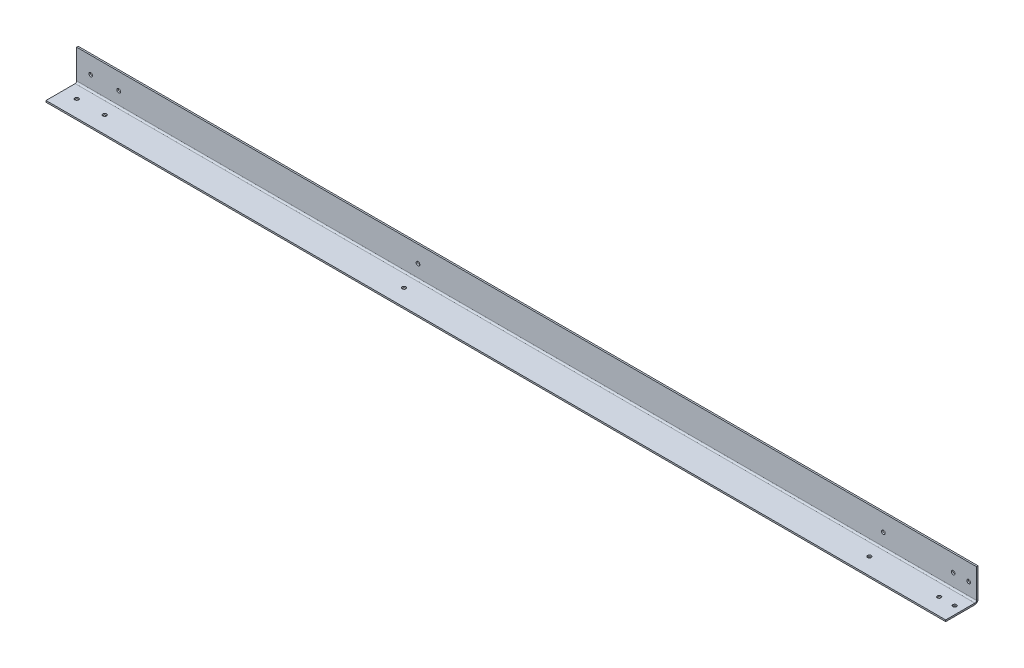
ISO-10303-21;
HEADER;
FILE_DESCRIPTION(('STEP AP214'),'2;1');
FILE_NAME('part.step','',(''),(''),'','','');
FILE_SCHEMA(('AUTOMOTIVE_DESIGN { 1 0 10303 214 1 1 1 1 }'));
ENDSEC;
DATA;
#1=APPLICATION_CONTEXT('core data for automotive mechanical design processes');
#2=APPLICATION_PROTOCOL_DEFINITION('international standard','automotive_design',2000,#1);
#3=PRODUCT_CONTEXT('',#1,'mechanical');
#4=PRODUCT('Part','Part','',(#3));
#5=PRODUCT_RELATED_PRODUCT_CATEGORY('part','',(#4));
#6=PRODUCT_DEFINITION_FORMATION('','',#4);
#7=PRODUCT_DEFINITION_CONTEXT('part definition',#1,'design');
#8=PRODUCT_DEFINITION('design','',#6,#7);
#9=PRODUCT_DEFINITION_SHAPE('','',#8);
#10=(LENGTH_UNIT() NAMED_UNIT(*) SI_UNIT(.MILLI.,.METRE.));
#11=(NAMED_UNIT(*) PLANE_ANGLE_UNIT() SI_UNIT($,.RADIAN.));
#12=(NAMED_UNIT(*) SI_UNIT($,.STERADIAN.) SOLID_ANGLE_UNIT());
#13=UNCERTAINTY_MEASURE_WITH_UNIT(LENGTH_MEASURE(1.E-05),#10,'distance_accuracy_value','');
#14=(GEOMETRIC_REPRESENTATION_CONTEXT(3) GLOBAL_UNCERTAINTY_ASSIGNED_CONTEXT((#13)) GLOBAL_UNIT_ASSIGNED_CONTEXT((#10,
#11,#12)) REPRESENTATION_CONTEXT('',''));
#15=CARTESIAN_POINT('',(0.,0.,0.));
#16=DIRECTION('',(0.,0.,1.));
#17=DIRECTION('',(1.,0.,0.));
#18=AXIS2_PLACEMENT_3D('',#15,#16,#17);
#19=CARTESIAN_POINT('',(-1450.,-4.10951377451911,-0.390486225480787));
#20=DIRECTION('',(-1.,0.,0.));
#21=DIRECTION('',(0.,1.,0.));
#22=AXIS2_PLACEMENT_3D('',#19,#20,#21);
#23=PLANE('',#22);
#24=DIRECTION('',(0.,0.,1.));
#25=VECTOR('',#24,1.);
#26=CARTESIAN_POINT('',(-1450.,0.890486225480891,-0.390486225480804));
#27=LINE('',#26,#25);
#28=CARTESIAN_POINT('',(-1450.,0.89048622548091,5.00000000000003));
#29=VERTEX_POINT('',#28);
#30=CARTESIAN_POINT('',(-1450.,0.890486225481238,99.1095137745192));
#31=VERTEX_POINT('',#30);
#32=EDGE_CURVE('E81',#29,#31,#27,.T.);
#33=ORIENTED_EDGE('',*,*,#32,.F.);
#34=DIRECTION('',(0.,-1.,0.));
#35=VECTOR('',#34,1.);
#36=CARTESIAN_POINT('',(-1450.,-4.10951377451913,5.00000000000003));
#37=LINE('',#36,#35);
#38=CARTESIAN_POINT('',(-1450.,-4.10951377451909,5.00000000000003));
#39=VERTEX_POINT('',#38);
#40=EDGE_CURVE('E323',#29,#39,#37,.T.);
#41=ORIENTED_EDGE('',*,*,#40,.T.);
#42=DIRECTION('',(0.,0.,1.));
#43=VECTOR('',#42,1.);
#44=CARTESIAN_POINT('',(-1450.,-4.10951377451911,-0.390486225480787));
#45=LINE('',#44,#43);
#46=CARTESIAN_POINT('',(-1450.,-4.10951377451876,99.1095137745192));
#47=VERTEX_POINT('',#46);
#48=EDGE_CURVE('E61',#39,#47,#45,.T.);
#49=ORIENTED_EDGE('',*,*,#48,.T.);
#50=DIRECTION('',(0.,1.,0.));
#51=VECTOR('',#50,1.);
#52=CARTESIAN_POINT('',(-1450.,-4.10951377451876,99.1095137745192));
#53=LINE('',#52,#51);
#54=EDGE_CURVE('E335',#47,#31,#53,.T.);
#55=ORIENTED_EDGE('',*,*,#54,.T.);
#56=EDGE_LOOP('',(#33,#41,#49,#55));
#57=FACE_BOUND('',#56,.T.);
#58=ADVANCED_FACE('F57',(#57),#23,.T.);
#59=CARTESIAN_POINT('',(1450.,-4.10951377451911,-0.390486225480787));
#60=DIRECTION('',(1.,0.,0.));
#61=DIRECTION('',(0.,-1.,0.));
#62=AXIS2_PLACEMENT_3D('',#59,#60,#61);
#63=PLANE('',#62);
#64=DIRECTION('',(0.,0.,-1.));
#65=VECTOR('',#64,1.);
#66=CARTESIAN_POINT('',(1450.,-4.10951377451911,-0.390486225480787));
#67=LINE('',#66,#65);
#68=CARTESIAN_POINT('',(1450.,-4.10951377451876,99.1095137745192));
#69=VERTEX_POINT('',#68);
#70=CARTESIAN_POINT('',(1450.,-4.10951377451909,5.00000000000003));
#71=VERTEX_POINT('',#70);
#72=EDGE_CURVE('E332',#69,#71,#67,.T.);
#73=ORIENTED_EDGE('',*,*,#72,.T.);
#74=DIRECTION('',(0.,1.,0.));
#75=VECTOR('',#74,1.);
#76=CARTESIAN_POINT('',(1450.,-4.10951377451913,5.00000000000003));
#77=LINE('',#76,#75);
#78=CARTESIAN_POINT('',(1450.,0.89048622548091,5.00000000000003));
#79=VERTEX_POINT('',#78);
#80=EDGE_CURVE('E12',#71,#79,#77,.T.);
#81=ORIENTED_EDGE('',*,*,#80,.T.);
#82=DIRECTION('',(0.,0.,-1.));
#83=VECTOR('',#82,1.);
#84=CARTESIAN_POINT('',(1450.,0.890486225480891,-0.390486225480804));
#85=LINE('',#84,#83);
#86=CARTESIAN_POINT('',(1450.,0.890486225481238,99.1095137745192));
#87=VERTEX_POINT('',#86);
#88=EDGE_CURVE('E74',#87,#79,#85,.T.);
#89=ORIENTED_EDGE('',*,*,#88,.F.);
#90=DIRECTION('',(0.,1.,0.));
#91=VECTOR('',#90,1.);
#92=CARTESIAN_POINT('',(1450.,-4.10951377451876,99.1095137745192));
#93=LINE('',#92,#91);
#94=EDGE_CURVE('E328',#69,#87,#93,.T.);
#95=ORIENTED_EDGE('',*,*,#94,.F.);
#96=EDGE_LOOP('',(#73,#81,#89,#95));
#97=FACE_BOUND('',#96,.T.);
#98=ADVANCED_FACE('F59',(#97),#63,.T.);
#99=CARTESIAN_POINT('',(-1450.,0.890486225480889,-0.890486225480825));
#100=DIRECTION('',(0.,1.,0.));
#101=DIRECTION('',(1.,0.,0.));
#102=AXIS2_PLACEMENT_3D('',#99,#100,#101);
#103=PLANE('',#102);
#104=CARTESIAN_POINT('',(-1405.,0.89048622548105,44.9999999999999));
#105=DIRECTION('',(0.,1.,0.));
#106=DIRECTION('',(0.,0.,1.));
#107=AXIS2_PLACEMENT_3D('',#104,#105,#106);
#108=CIRCLE('',#107,6.0000000000001);
#109=CARTESIAN_POINT('',(-1405.,0.890486225481071,51.));
#110=VERTEX_POINT('',#109);
#111=EDGE_CURVE('E353',#110,#110,#108,.T.);
#112=ORIENTED_EDGE('',*,*,#111,.F.);
#113=EDGE_LOOP('',(#112));
#114=FACE_BOUND('',#113,.T.);
#115=CARTESIAN_POINT('',(1150.,0.89048622548105,44.9999999999999));
#116=DIRECTION('',(0.,1.,0.));
#117=DIRECTION('',(0.,0.,1.));
#118=AXIS2_PLACEMENT_3D('',#115,#116,#117);
#119=CIRCLE('',#118,6.0000000000001);
#120=CARTESIAN_POINT('',(1150.,0.890486225481071,51.));
#121=VERTEX_POINT('',#120);
#122=EDGE_CURVE('E365',#121,#121,#119,.T.);
#123=ORIENTED_EDGE('',*,*,#122,.F.);
#124=EDGE_LOOP('',(#123));
#125=FACE_BOUND('',#124,.T.);
#126=CARTESIAN_POINT('',(1375.,0.89048622548105,44.9999999999995));
#127=DIRECTION('',(0.,1.,0.));
#128=DIRECTION('',(0.,0.,-1.));
#129=AXIS2_PLACEMENT_3D('',#126,#127,#128);
#130=CIRCLE('',#129,6.0000000000001);
#131=CARTESIAN_POINT('',(1375.,0.890486225481029,38.9999999999994));
#132=VERTEX_POINT('',#131);
#133=EDGE_CURVE('E372',#132,#132,#130,.T.);
#134=ORIENTED_EDGE('',*,*,#133,.F.);
#135=EDGE_LOOP('',(#134));
#136=FACE_BOUND('',#135,.T.);
#137=CARTESIAN_POINT('',(1425.,0.89048622548105,44.9999999999999));
#138=DIRECTION('',(0.,1.,0.));
#139=DIRECTION('',(0.,0.,1.));
#140=AXIS2_PLACEMENT_3D('',#137,#138,#139);
#141=CIRCLE('',#140,6.0000000000001);
#142=CARTESIAN_POINT('',(1425.,0.890486225481071,51.));
#143=VERTEX_POINT('',#142);
#144=EDGE_CURVE('E385',#143,#143,#141,.T.);
#145=ORIENTED_EDGE('',*,*,#144,.F.);
#146=EDGE_LOOP('',(#145));
#147=FACE_BOUND('',#146,.T.);
#148=CARTESIAN_POINT('',(-350.,0.89048622548105,44.9999999999999));
#149=DIRECTION('',(0.,1.,0.));
#150=DIRECTION('',(0.,0.,1.));
#151=AXIS2_PLACEMENT_3D('',#148,#149,#150);
#152=CIRCLE('',#151,6.0000000000001);
#153=CARTESIAN_POINT('',(-350.,0.890486225481071,51.));
#154=VERTEX_POINT('',#153);
#155=EDGE_CURVE('E379',#154,#154,#152,.T.);
#156=ORIENTED_EDGE('',*,*,#155,.F.);
#157=EDGE_LOOP('',(#156));
#158=FACE_BOUND('',#157,.T.);
#159=CARTESIAN_POINT('',(-1315.,0.89048622548105,44.9999999999999));
#160=DIRECTION('',(0.,1.,0.));
#161=DIRECTION('',(0.,0.,1.));
#162=AXIS2_PLACEMENT_3D('',#159,#160,#161);
#163=CIRCLE('',#162,6.0000000000001);
#164=CARTESIAN_POINT('',(-1315.,0.890486225481071,51.));
#165=VERTEX_POINT('',#164);
#166=EDGE_CURVE('E373',#165,#165,#163,.T.);
#167=ORIENTED_EDGE('',*,*,#166,.F.);
#168=EDGE_LOOP('',(#167));
#169=FACE_BOUND('',#168,.T.);
#170=ORIENTED_EDGE('',*,*,#88,.T.);
#171=DIRECTION('',(-1.,0.,0.));
#172=VECTOR('',#171,1.);
#173=CARTESIAN_POINT('',(-1450.,0.89048622548091,5.00000000000005));
#174=LINE('',#173,#172);
#175=EDGE_CURVE('E66',#79,#29,#174,.T.);
#176=ORIENTED_EDGE('',*,*,#175,.T.);
#177=ORIENTED_EDGE('',*,*,#32,.T.);
#178=DIRECTION('',(1.,0.,0.));
#179=VECTOR('',#178,1.);
#180=CARTESIAN_POINT('',(-1450.,0.890486225481238,99.1095137745192));
#181=LINE('',#180,#179);
#182=EDGE_CURVE('E337',#31,#87,#181,.T.);
#183=ORIENTED_EDGE('',*,*,#182,.T.);
#184=EDGE_LOOP('',(#170,#176,#177,#183));
#185=FACE_BOUND('',#184,.T.);
#186=ADVANCED_FACE('F540',(#114,#125,#136,#147,#158,#169,#185),#103,.T.);
#187=CARTESIAN_POINT('',(-1450.,-4.10951377451876,99.1095137745192));
#188=DIRECTION('',(0.,0.,1.));
#189=DIRECTION('',(0.,-1.,0.));
#190=AXIS2_PLACEMENT_3D('',#187,#188,#189);
#191=PLANE('',#190);
#192=ORIENTED_EDGE('',*,*,#182,.F.);
#193=ORIENTED_EDGE('',*,*,#54,.F.);
#194=DIRECTION('',(1.,0.,0.));
#195=VECTOR('',#194,1.);
#196=CARTESIAN_POINT('',(-1450.,-4.10951377451876,99.1095137745192));
#197=LINE('',#196,#195);
#198=EDGE_CURVE('E336',#47,#69,#197,.T.);
#199=ORIENTED_EDGE('',*,*,#198,.T.);
#200=ORIENTED_EDGE('',*,*,#94,.T.);
#201=EDGE_LOOP('',(#192,#193,#199,#200));
#202=FACE_BOUND('',#201,.T.);
#203=ADVANCED_FACE('F348',(#202),#191,.T.);
#204=CARTESIAN_POINT('',(-1450.,-4.10951377451911,-0.890486225480808));
#205=DIRECTION('',(0.,1.,0.));
#206=DIRECTION('',(1.,0.,0.));
#207=AXIS2_PLACEMENT_3D('',#204,#205,#206);
#208=PLANE('',#207);
#209=CARTESIAN_POINT('',(-1405.,-4.10951377451895,44.9999999999999));
#210=DIRECTION('',(0.,1.,0.));
#211=DIRECTION('',(0.,0.,1.));
#212=AXIS2_PLACEMENT_3D('',#209,#210,#211);
#213=CIRCLE('',#212,6.0000000000001);
#214=CARTESIAN_POINT('',(-1405.,-4.10951377451893,51.));
#215=VERTEX_POINT('',#214);
#216=EDGE_CURVE('E351',#215,#215,#213,.F.);
#217=ORIENTED_EDGE('',*,*,#216,.F.);
#218=EDGE_LOOP('',(#217));
#219=FACE_BOUND('',#218,.T.);
#220=CARTESIAN_POINT('',(1150.,-4.10951377451895,44.9999999999999));
#221=DIRECTION('',(0.,1.,0.));
#222=DIRECTION('',(0.,0.,1.));
#223=AXIS2_PLACEMENT_3D('',#220,#221,#222);
#224=CIRCLE('',#223,6.0000000000001);
#225=CARTESIAN_POINT('',(1150.,-4.10951377451893,51.));
#226=VERTEX_POINT('',#225);
#227=EDGE_CURVE('E368',#226,#226,#224,.F.);
#228=ORIENTED_EDGE('',*,*,#227,.F.);
#229=EDGE_LOOP('',(#228));
#230=FACE_BOUND('',#229,.T.);
#231=CARTESIAN_POINT('',(1375.,-4.10951377451895,44.9999999999996));
#232=DIRECTION('',(0.,1.,0.));
#233=DIRECTION('',(0.,0.,1.));
#234=AXIS2_PLACEMENT_3D('',#231,#232,#233);
#235=CIRCLE('',#234,6.0000000000001);
#236=CARTESIAN_POINT('',(1375.,-4.10951377451893,50.9999999999997));
#237=VERTEX_POINT('',#236);
#238=EDGE_CURVE('E388',#237,#237,#235,.F.);
#239=ORIENTED_EDGE('',*,*,#238,.F.);
#240=EDGE_LOOP('',(#239));
#241=FACE_BOUND('',#240,.T.);
#242=CARTESIAN_POINT('',(1425.,-4.10951377451895,44.9999999999999));
#243=DIRECTION('',(0.,1.,0.));
#244=DIRECTION('',(0.,0.,1.));
#245=AXIS2_PLACEMENT_3D('',#242,#243,#244);
#246=CIRCLE('',#245,6.0000000000001);
#247=CARTESIAN_POINT('',(1425.,-4.10951377451893,51.));
#248=VERTEX_POINT('',#247);
#249=EDGE_CURVE('E382',#248,#248,#246,.F.);
#250=ORIENTED_EDGE('',*,*,#249,.F.);
#251=EDGE_LOOP('',(#250));
#252=FACE_BOUND('',#251,.T.);
#253=CARTESIAN_POINT('',(-350.,-4.10951377451895,44.9999999999999));
#254=DIRECTION('',(0.,1.,0.));
#255=DIRECTION('',(0.,0.,1.));
#256=AXIS2_PLACEMENT_3D('',#253,#254,#255);
#257=CIRCLE('',#256,6.0000000000001);
#258=CARTESIAN_POINT('',(-350.,-4.10951377451893,51.));
#259=VERTEX_POINT('',#258);
#260=EDGE_CURVE('E376',#259,#259,#257,.F.);
#261=ORIENTED_EDGE('',*,*,#260,.F.);
#262=EDGE_LOOP('',(#261));
#263=FACE_BOUND('',#262,.T.);
#264=CARTESIAN_POINT('',(-1315.,-4.10951377451895,44.9999999999999));
#265=DIRECTION('',(0.,1.,0.));
#266=DIRECTION('',(0.,0.,1.));
#267=AXIS2_PLACEMENT_3D('',#264,#265,#266);
#268=CIRCLE('',#267,6.0000000000001);
#269=CARTESIAN_POINT('',(-1315.,-4.10951377451893,51.));
#270=VERTEX_POINT('',#269);
#271=EDGE_CURVE('E361',#270,#270,#268,.F.);
#272=ORIENTED_EDGE('',*,*,#271,.F.);
#273=EDGE_LOOP('',(#272));
#274=FACE_BOUND('',#273,.T.);
#275=DIRECTION('',(-1.,0.,0.));
#276=VECTOR('',#275,1.);
#277=CARTESIAN_POINT('',(-1450.,-4.10951377451909,5.00000000000003));
#278=LINE('',#277,#276);
#279=EDGE_CURVE('E325',#71,#39,#278,.T.);
#280=ORIENTED_EDGE('',*,*,#279,.F.);
#281=ORIENTED_EDGE('',*,*,#72,.F.);
#282=ORIENTED_EDGE('',*,*,#198,.F.);
#283=ORIENTED_EDGE('',*,*,#48,.F.);
#284=EDGE_LOOP('',(#280,#281,#282,#283));
#285=FACE_BOUND('',#284,.T.);
#286=ADVANCED_FACE('F527',(#219,#230,#241,#252,#263,#274,#285),#208,.F.);
#287=CARTESIAN_POINT('',(-1450.,100.,-5.));
#288=DIRECTION('',(0.,1.,0.));
#289=DIRECTION('',(0.,0.,1.));
#290=AXIS2_PLACEMENT_3D('',#287,#288,#289);
#291=PLANE('',#290);
#292=DIRECTION('',(-1.,0.,0.));
#293=VECTOR('',#292,1.);
#294=CARTESIAN_POINT('',(-1450.,100.,0.));
#295=LINE('',#294,#293);
#296=CARTESIAN_POINT('',(1450.,100.,0.));
#297=VERTEX_POINT('',#296);
#298=CARTESIAN_POINT('',(-1450.,100.,0.));
#299=VERTEX_POINT('',#298);
#300=EDGE_CURVE('E442',#297,#299,#295,.T.);
#301=ORIENTED_EDGE('',*,*,#300,.F.);
#302=DIRECTION('',(0.,0.,1.));
#303=VECTOR('',#302,1.);
#304=CARTESIAN_POINT('',(1450.,100.,-5.));
#305=LINE('',#304,#303);
#306=CARTESIAN_POINT('',(1450.,100.,-5.));
#307=VERTEX_POINT('',#306);
#308=EDGE_CURVE('E338',#307,#297,#305,.T.);
#309=ORIENTED_EDGE('',*,*,#308,.F.);
#310=DIRECTION('',(-1.,0.,0.));
#311=VECTOR('',#310,1.);
#312=CARTESIAN_POINT('',(-1450.,100.,-5.));
#313=LINE('',#312,#311);
#314=CARTESIAN_POINT('',(-1450.,100.,-5.));
#315=VERTEX_POINT('',#314);
#316=EDGE_CURVE('E421',#307,#315,#313,.T.);
#317=ORIENTED_EDGE('',*,*,#316,.T.);
#318=DIRECTION('',(0.,0.,1.));
#319=VECTOR('',#318,1.);
#320=CARTESIAN_POINT('',(-1450.,100.,-5.));
#321=LINE('',#320,#319);
#322=EDGE_CURVE('E425',#315,#299,#321,.T.);
#323=ORIENTED_EDGE('',*,*,#322,.T.);
#324=EDGE_LOOP('',(#301,#309,#317,#323));
#325=FACE_BOUND('',#324,.T.);
#326=ADVANCED_FACE('F453',(#325),#291,.T.);
#327=CARTESIAN_POINT('',(-1450.,0.,-5.));
#328=DIRECTION('',(0.,0.,1.));
#329=DIRECTION('',(1.,0.,0.));
#330=AXIS2_PLACEMENT_3D('',#327,#328,#329);
#331=PLANE('',#330);
#332=CARTESIAN_POINT('',(-1405.,45.8904862254809,-5.));
#333=DIRECTION('',(0.,0.,1.));
#334=DIRECTION('',(1.,0.,0.));
#335=AXIS2_PLACEMENT_3D('',#332,#333,#334);
#336=CIRCLE('',#335,6.0000000000001);
#337=CARTESIAN_POINT('',(-1399.,45.8904862254809,-5.));
#338=VERTEX_POINT('',#337);
#339=EDGE_CURVE('E369',#338,#338,#336,.F.);
#340=ORIENTED_EDGE('',*,*,#339,.F.);
#341=EDGE_LOOP('',(#340));
#342=FACE_BOUND('',#341,.T.);
#343=CARTESIAN_POINT('',(1150.,45.8904862254809,-5.));
#344=DIRECTION('',(0.,0.,1.));
#345=DIRECTION('',(1.,0.,0.));
#346=AXIS2_PLACEMENT_3D('',#343,#344,#345);
#347=CIRCLE('',#346,6.0000000000001);
#348=CARTESIAN_POINT('',(1156.,45.8904862254809,-5.));
#349=VERTEX_POINT('',#348);
#350=EDGE_CURVE('E649',#349,#349,#347,.F.);
#351=ORIENTED_EDGE('',*,*,#350,.F.);
#352=EDGE_LOOP('',(#351));
#353=FACE_BOUND('',#352,.T.);
#354=CARTESIAN_POINT('',(1375.,45.8904862254812,-5.));
#355=DIRECTION('',(0.,0.,1.));
#356=DIRECTION('',(1.,0.,0.));
#357=AXIS2_PLACEMENT_3D('',#354,#355,#356);
#358=CIRCLE('',#357,6.0000000000001);
#359=CARTESIAN_POINT('',(1381.,45.8904862254812,-5.));
#360=VERTEX_POINT('',#359);
#361=EDGE_CURVE('E665',#360,#360,#358,.F.);
#362=ORIENTED_EDGE('',*,*,#361,.F.);
#363=EDGE_LOOP('',(#362));
#364=FACE_BOUND('',#363,.T.);
#365=CARTESIAN_POINT('',(1425.,45.8904862254809,-5.));
#366=DIRECTION('',(0.,0.,1.));
#367=DIRECTION('',(1.,0.,0.));
#368=AXIS2_PLACEMENT_3D('',#365,#366,#367);
#369=CIRCLE('',#368,6.0000000000001);
#370=CARTESIAN_POINT('',(1431.,45.8904862254809,-5.));
#371=VERTEX_POINT('',#370);
#372=EDGE_CURVE('E659',#371,#371,#369,.F.);
#373=ORIENTED_EDGE('',*,*,#372,.F.);
#374=EDGE_LOOP('',(#373));
#375=FACE_BOUND('',#374,.T.);
#376=CARTESIAN_POINT('',(-350.,45.8904862254809,-5.));
#377=DIRECTION('',(0.,0.,1.));
#378=DIRECTION('',(1.,0.,0.));
#379=AXIS2_PLACEMENT_3D('',#376,#377,#378);
#380=CIRCLE('',#379,6.0000000000001);
#381=CARTESIAN_POINT('',(-344.,45.8904862254809,-5.));
#382=VERTEX_POINT('',#381);
#383=EDGE_CURVE('E654',#382,#382,#380,.F.);
#384=ORIENTED_EDGE('',*,*,#383,.F.);
#385=EDGE_LOOP('',(#384));
#386=FACE_BOUND('',#385,.T.);
#387=CARTESIAN_POINT('',(-1315.,45.8904862254809,-5.));
#388=DIRECTION('',(0.,0.,1.));
#389=DIRECTION('',(1.,0.,0.));
#390=AXIS2_PLACEMENT_3D('',#387,#388,#389);
#391=CIRCLE('',#390,6.0000000000001);
#392=CARTESIAN_POINT('',(-1309.,45.8904862254809,-5.));
#393=VERTEX_POINT('',#392);
#394=EDGE_CURVE('E639',#393,#393,#391,.F.);
#395=ORIENTED_EDGE('',*,*,#394,.F.);
#396=EDGE_LOOP('',(#395));
#397=FACE_BOUND('',#396,.T.);
#398=DIRECTION('',(0.,1.,0.));
#399=VECTOR('',#398,1.);
#400=CARTESIAN_POINT('',(1450.,100.,-5.));
#401=LINE('',#400,#399);
#402=CARTESIAN_POINT('',(1450.,5.89048622548091,-5.));
#403=VERTEX_POINT('',#402);
#404=EDGE_CURVE('E443',#403,#307,#401,.T.);
#405=ORIENTED_EDGE('',*,*,#404,.F.);
#406=DIRECTION('',(-1.,0.,0.));
#407=VECTOR('',#406,1.);
#408=CARTESIAN_POINT('',(-1450.,5.89048622548091,-5.));
#409=LINE('',#408,#407);
#410=CARTESIAN_POINT('',(-1450.,5.89048622548091,-5.));
#411=VERTEX_POINT('',#410);
#412=EDGE_CURVE('E415',#403,#411,#409,.T.);
#413=ORIENTED_EDGE('',*,*,#412,.T.);
#414=DIRECTION('',(0.,-1.,0.));
#415=VECTOR('',#414,1.);
#416=CARTESIAN_POINT('',(-1450.,100.,-5.));
#417=LINE('',#416,#415);
#418=EDGE_CURVE('E450',#315,#411,#417,.T.);
#419=ORIENTED_EDGE('',*,*,#418,.F.);
#420=ORIENTED_EDGE('',*,*,#316,.F.);
#421=EDGE_LOOP('',(#405,#413,#419,#420));
#422=FACE_BOUND('',#421,.T.);
#423=ADVANCED_FACE('F459',(#342,#353,#364,#375,#386,#397,#422),#331,.F.);
#424=CARTESIAN_POINT('',(-1450.,100.,-5.));
#425=DIRECTION('',(-1.,0.,0.));
#426=DIRECTION('',(0.,0.,1.));
#427=AXIS2_PLACEMENT_3D('',#424,#425,#426);
#428=PLANE('',#427);
#429=DIRECTION('',(0.,0.,-1.));
#430=VECTOR('',#429,1.);
#431=CARTESIAN_POINT('',(-1450.,5.89048622548091,-5.00000000000066));
#432=LINE('',#431,#430);
#433=CARTESIAN_POINT('',(-1450.,5.89048622548087,0.));
#434=VERTEX_POINT('',#433);
#435=EDGE_CURVE('E418',#434,#411,#432,.T.);
#436=ORIENTED_EDGE('',*,*,#435,.F.);
#437=DIRECTION('',(0.,-1.,0.));
#438=VECTOR('',#437,1.);
#439=CARTESIAN_POINT('',(-1450.,100.,0.));
#440=LINE('',#439,#438);
#441=EDGE_CURVE('E440',#299,#434,#440,.T.);
#442=ORIENTED_EDGE('',*,*,#441,.F.);
#443=ORIENTED_EDGE('',*,*,#322,.F.);
#444=ORIENTED_EDGE('',*,*,#418,.T.);
#445=EDGE_LOOP('',(#436,#442,#443,#444));
#446=FACE_BOUND('',#445,.T.);
#447=ADVANCED_FACE('F457',(#446),#428,.T.);
#448=CARTESIAN_POINT('',(-1450.,0.,0.));
#449=DIRECTION('',(0.,0.,1.));
#450=DIRECTION('',(1.,0.,0.));
#451=AXIS2_PLACEMENT_3D('',#448,#449,#450);
#452=PLANE('',#451);
#453=CARTESIAN_POINT('',(-1405.,45.8904862254809,0.));
#454=DIRECTION('',(0.,0.,1.));
#455=DIRECTION('',(1.,0.,0.));
#456=AXIS2_PLACEMENT_3D('',#453,#454,#455);
#457=CIRCLE('',#456,6.0000000000001);
#458=CARTESIAN_POINT('',(-1399.,45.8904862254809,0.));
#459=VERTEX_POINT('',#458);
#460=EDGE_CURVE('E638',#459,#459,#457,.T.);
#461=ORIENTED_EDGE('',*,*,#460,.F.);
#462=EDGE_LOOP('',(#461));
#463=FACE_BOUND('',#462,.T.);
#464=CARTESIAN_POINT('',(1150.,45.8904862254809,0.));
#465=DIRECTION('',(0.,0.,1.));
#466=DIRECTION('',(1.,0.,0.));
#467=AXIS2_PLACEMENT_3D('',#464,#465,#466);
#468=CIRCLE('',#467,6.0000000000001);
#469=CARTESIAN_POINT('',(1156.,45.8904862254809,0.));
#470=VERTEX_POINT('',#469);
#471=EDGE_CURVE('E646',#470,#470,#468,.T.);
#472=ORIENTED_EDGE('',*,*,#471,.F.);
#473=EDGE_LOOP('',(#472));
#474=FACE_BOUND('',#473,.T.);
#475=CARTESIAN_POINT('',(1375.,45.8904862254812,0.));
#476=DIRECTION('',(0.,0.,1.));
#477=DIRECTION('',(-1.,0.,0.));
#478=AXIS2_PLACEMENT_3D('',#475,#476,#477);
#479=CIRCLE('',#478,6.0000000000001);
#480=CARTESIAN_POINT('',(1369.,45.8904862254812,0.));
#481=VERTEX_POINT('',#480);
#482=EDGE_CURVE('E652',#481,#481,#479,.T.);
#483=ORIENTED_EDGE('',*,*,#482,.F.);
#484=EDGE_LOOP('',(#483));
#485=FACE_BOUND('',#484,.T.);
#486=CARTESIAN_POINT('',(1425.,45.8904862254809,0.));
#487=DIRECTION('',(0.,0.,1.));
#488=DIRECTION('',(1.,0.,0.));
#489=AXIS2_PLACEMENT_3D('',#486,#487,#488);
#490=CIRCLE('',#489,6.0000000000001);
#491=CARTESIAN_POINT('',(1431.,45.8904862254809,0.));
#492=VERTEX_POINT('',#491);
#493=EDGE_CURVE('E662',#492,#492,#490,.T.);
#494=ORIENTED_EDGE('',*,*,#493,.F.);
#495=EDGE_LOOP('',(#494));
#496=FACE_BOUND('',#495,.T.);
#497=CARTESIAN_POINT('',(-350.,45.8904862254809,0.));
#498=DIRECTION('',(0.,0.,1.));
#499=DIRECTION('',(1.,0.,0.));
#500=AXIS2_PLACEMENT_3D('',#497,#498,#499);
#501=CIRCLE('',#500,6.0000000000001);
#502=CARTESIAN_POINT('',(-344.,45.8904862254809,0.));
#503=VERTEX_POINT('',#502);
#504=EDGE_CURVE('E656',#503,#503,#501,.T.);
#505=ORIENTED_EDGE('',*,*,#504,.F.);
#506=EDGE_LOOP('',(#505));
#507=FACE_BOUND('',#506,.T.);
#508=CARTESIAN_POINT('',(-1315.,45.8904862254809,0.));
#509=DIRECTION('',(0.,0.,1.));
#510=DIRECTION('',(1.,0.,0.));
#511=AXIS2_PLACEMENT_3D('',#508,#509,#510);
#512=CIRCLE('',#511,6.0000000000001);
#513=CARTESIAN_POINT('',(-1309.,45.8904862254809,0.));
#514=VERTEX_POINT('',#513);
#515=EDGE_CURVE('E643',#514,#514,#512,.T.);
#516=ORIENTED_EDGE('',*,*,#515,.F.);
#517=EDGE_LOOP('',(#516));
#518=FACE_BOUND('',#517,.T.);
#519=DIRECTION('',(-1.,0.,0.));
#520=VECTOR('',#519,1.);
#521=CARTESIAN_POINT('',(-1450.,5.89048622548088,0.));
#522=LINE('',#521,#520);
#523=CARTESIAN_POINT('',(1450.,5.89048622548087,0.));
#524=VERTEX_POINT('',#523);
#525=EDGE_CURVE('E422',#524,#434,#522,.T.);
#526=ORIENTED_EDGE('',*,*,#525,.F.);
#527=DIRECTION('',(0.,1.,0.));
#528=VECTOR('',#527,1.);
#529=CARTESIAN_POINT('',(1450.,100.,0.));
#530=LINE('',#529,#528);
#531=EDGE_CURVE('E438',#524,#297,#530,.T.);
#532=ORIENTED_EDGE('',*,*,#531,.T.);
#533=ORIENTED_EDGE('',*,*,#300,.T.);
#534=ORIENTED_EDGE('',*,*,#441,.T.);
#535=EDGE_LOOP('',(#526,#532,#533,#534));
#536=FACE_BOUND('',#535,.T.);
#537=ADVANCED_FACE('F436',(#463,#474,#485,#496,#507,#518,#536),#452,.T.);
#538=CARTESIAN_POINT('',(1450.,100.,-5.));
#539=DIRECTION('',(1.,0.,0.));
#540=DIRECTION('',(0.,0.,-1.));
#541=AXIS2_PLACEMENT_3D('',#538,#539,#540);
#542=PLANE('',#541);
#543=DIRECTION('',(0.,0.,1.));
#544=VECTOR('',#543,1.);
#545=CARTESIAN_POINT('',(1450.,5.89048622548091,-5.00000000000066));
#546=LINE('',#545,#544);
#547=EDGE_CURVE('E162',#403,#524,#546,.T.);
#548=ORIENTED_EDGE('',*,*,#547,.F.);
#549=ORIENTED_EDGE('',*,*,#404,.T.);
#550=ORIENTED_EDGE('',*,*,#308,.T.);
#551=ORIENTED_EDGE('',*,*,#531,.F.);
#552=EDGE_LOOP('',(#548,#549,#550,#551));
#553=FACE_BOUND('',#552,.T.);
#554=ADVANCED_FACE('F460',(#553),#542,.T.);
#555=CARTESIAN_POINT('',(1450.,5.89048622548091,5.));
#556=DIRECTION('',(1.,0.,0.));
#557=DIRECTION('',(0.,0.,-1.));
#558=AXIS2_PLACEMENT_3D('',#555,#556,#557);
#559=PLANE('',#558);
#560=CARTESIAN_POINT('',(1450.,2.12727844716476,1.70784763153027));
#561=CARTESIAN_POINT('',(1450.,-1.63592933115138,-1.58430473693946));
#562=B_SPLINE_CURVE_WITH_KNOTS('',1,(#560,#561),.UNSPECIFIED.,.F.,.F.,(2,2),(0.,1.),.UNSPECIFIED.);
#563=CARTESIAN_POINT('',(1450.,2.12727844716476,1.70784763153027));
#564=VERTEX_POINT('',#563);
#565=CARTESIAN_POINT('',(1450.,-1.63592933115139,-1.58430473693945));
#566=VERTEX_POINT('',#565);
#567=EDGE_CURVE('E148',#564,#566,#562,.T.);
#568=ORIENTED_EDGE('',*,*,#567,.F.);
#569=CARTESIAN_POINT('',(1450.,5.89048622548091,5.));
#570=DIRECTION('',(-1.,0.,0.));
#571=DIRECTION('',(0.,0.,1.));
#572=AXIS2_PLACEMENT_3D('',#569,#570,#571);
#573=CIRCLE('',#572,5.);
#574=EDGE_CURVE('E233',#564,#79,#573,.T.);
#575=ORIENTED_EDGE('',*,*,#574,.T.);
#576=ORIENTED_EDGE('',*,*,#80,.F.);
#577=CARTESIAN_POINT('',(1450.,5.89048622548091,5.));
#578=DIRECTION('',(-1.,0.,0.));
#579=DIRECTION('',(0.,0.,-1.));
#580=AXIS2_PLACEMENT_3D('',#577,#578,#579);
#581=CIRCLE('',#580,10.);
#582=EDGE_CURVE('E168',#566,#71,#581,.T.);
#583=ORIENTED_EDGE('',*,*,#582,.F.);
#584=EDGE_LOOP('',(#568,#575,#576,#583));
#585=FACE_BOUND('',#584,.T.);
#586=ADVANCED_FACE('F169',(#585),#559,.T.);
#587=CARTESIAN_POINT('',(-1450.,5.89048622548091,5.));
#588=DIRECTION('',(-1.,0.,0.));
#589=DIRECTION('',(0.,0.,1.));
#590=AXIS2_PLACEMENT_3D('',#587,#588,#589);
#591=PLANE('',#590);
#592=ORIENTED_EDGE('',*,*,#40,.F.);
#593=CARTESIAN_POINT('',(-1450.,5.89048622548091,5.));
#594=DIRECTION('',(-1.,0.,0.));
#595=DIRECTION('',(0.,0.,1.));
#596=AXIS2_PLACEMENT_3D('',#593,#594,#595);
#597=CIRCLE('',#596,5.);
#598=CARTESIAN_POINT('',(-1450.,2.12727844716477,1.70784763153027));
#599=VERTEX_POINT('',#598);
#600=EDGE_CURVE('E224',#29,#599,#597,.F.);
#601=ORIENTED_EDGE('',*,*,#600,.T.);
#602=CARTESIAN_POINT('',(-1450.,-1.63592933115138,-1.58430473693946));
#603=CARTESIAN_POINT('',(-1450.,2.12727844716476,1.70784763153027));
#604=B_SPLINE_CURVE_WITH_KNOTS('',1,(#602,#603),.UNSPECIFIED.,.F.,.F.,(2,2),(0.,1.),.UNSPECIFIED.);
#605=CARTESIAN_POINT('',(-1450.,-1.63592933115138,-1.58430473693947));
#606=VERTEX_POINT('',#605);
#607=EDGE_CURVE('E163',#599,#606,#604,.F.);
#608=ORIENTED_EDGE('',*,*,#607,.T.);
#609=CARTESIAN_POINT('',(-1450.,5.89048622548091,5.));
#610=DIRECTION('',(1.,0.,0.));
#611=DIRECTION('',(0.,0.,1.));
#612=AXIS2_PLACEMENT_3D('',#609,#610,#611);
#613=CIRCLE('',#612,10.);
#614=EDGE_CURVE('E172',#39,#606,#613,.T.);
#615=ORIENTED_EDGE('',*,*,#614,.F.);
#616=EDGE_LOOP('',(#592,#601,#608,#615));
#617=FACE_BOUND('',#616,.T.);
#618=ADVANCED_FACE('F259',(#617),#591,.T.);
#619=CARTESIAN_POINT('',(-1450.,-1.63592933115138,-1.58430473693946));
#620=CARTESIAN_POINT('',(-1449.83775346825,-1.61461347096754,-1.60867056265688));
#621=CARTESIAN_POINT('',(-1449.71460099368,-1.56713975859406,-1.66305915082095));
#622=CARTESIAN_POINT('',(-1449.58851706758,-1.45381791176274,-1.7870709721564));
#623=CARTESIAN_POINT('',(-1449.55626301761,-1.40899271350338,-1.83544938467551));
#624=CARTESIAN_POINT('',(-1449.52254283078,-1.33054308574019,-1.91796038975865));
#625=CARTESIAN_POINT('',(-1449.51374624985,-1.30252276071086,-1.9471191482277));
#626=CARTESIAN_POINT('',(-1449.50421660048,-1.25759182455062,-1.9932425150594));
#627=CARTESIAN_POINT('',(-1449.50165092103,-1.24213133561825,-2.00901436454016));
#628=CARTESIAN_POINT('',(-1449.49871870736,-1.21820260431054,-2.03325472523254));
#629=CARTESIAN_POINT('',(-1449.49789402039,-1.21010335491965,-2.04143193382114));
#630=CARTESIAN_POINT('',(-1449.49655008161,-1.19365665266002,-2.05797816304459));
#631=CARTESIAN_POINT('',(-1449.4959362827,-1.18312368265685,-2.06853038760774));
#632=CARTESIAN_POINT('',(-1449.48696070816,-0.975647523253168,-2.27578694961522));
#633=CARTESIAN_POINT('',(-1449.65509476149,-0.811630070528725,-2.42335093036827));
#634=CARTESIAN_POINT('',(-1450.,-0.693818511458641,-2.52641555663221));
#635=CARTESIAN_POINT('',(-1450.,2.12727844716476,1.70784763153027));
#636=CARTESIAN_POINT('',(-1449.83775285766,2.137936417366,1.69566467282323));
#637=CARTESIAN_POINT('',(-1449.71460099368,2.16167323344342,1.66847042458953));
#638=CARTESIAN_POINT('',(-1449.58851706758,2.21833415685909,1.6064645139218));
#639=CARTESIAN_POINT('',(-1449.55626301761,2.24074675598876,1.58227530766225));
#640=CARTESIAN_POINT('',(-1449.52254283078,2.27997156987036,1.54101980512067));
#641=CARTESIAN_POINT('',(-1449.51374624985,2.29398173238502,1.52644042588615));
#642=CARTESIAN_POINT('',(-1449.50421660048,2.31644720046514,1.5033787424703));
#643=CARTESIAN_POINT('',(-1449.50165092103,2.32417744493133,1.49549281772992));
#644=CARTESIAN_POINT('',(-1449.49871870736,2.33614181058518,1.48337263738373));
#645=CARTESIAN_POINT('',(-1449.49789402039,2.34019143528063,1.47928403308943));
#646=CARTESIAN_POINT('',(-1449.49655008161,2.34841478641044,1.4710109184777));
#647=CARTESIAN_POINT('',(-1449.4959362827,2.35368127141203,1.46573480619613));
#648=CARTESIAN_POINT('',(-1449.48696070816,2.45741935111387,1.36210652519239));
#649=CARTESIAN_POINT('',(-1449.65507896119,2.53942537896897,1.28832689554032));
#650=CARTESIAN_POINT('',(-1450.,2.59833385701113,1.23679222168389));
#651=B_SPLINE_SURFACE_WITH_KNOTS('',1,3,((#619,#620,#621,#622,#623,#624,#625,#626,#627,#628,
#629,#630,#631,#632,#633,#634),(#635,#636,#637,#638,#639,#640,#641,#642,#643,#644,#645,#646,
#647,#648,#649,#650)),.UNSPECIFIED.,.F.,.F.,.F.,(2,2),(4,2,2,2,2,2,2,4),(0.,1.),(0.,0.25,0.375,
0.4375,0.46875,0.484375,0.5,1.),.UNSPECIFIED.);
#652=CARTESIAN_POINT('',(-1450.,2.12727844716476,1.70784763153027));
#653=CARTESIAN_POINT('',(-1449.83775285766,2.137936417366,1.69566467282323));
#654=CARTESIAN_POINT('',(-1449.71460099368,2.16167323344342,1.66847042458953));
#655=CARTESIAN_POINT('',(-1449.58851706758,2.21833415685909,1.6064645139218));
#656=CARTESIAN_POINT('',(-1449.55626301761,2.24074675598876,1.58227530766225));
#657=CARTESIAN_POINT('',(-1449.52254283078,2.27997156987036,1.54101980512067));
#658=CARTESIAN_POINT('',(-1449.51374624985,2.29398173238502,1.52644042588615));
#659=CARTESIAN_POINT('',(-1449.50421660048,2.31644720046514,1.5033787424703));
#660=CARTESIAN_POINT('',(-1449.50165092103,2.32417744493133,1.49549281772992));
#661=CARTESIAN_POINT('',(-1449.49871870736,2.33614181058518,1.48337263738373));
#662=CARTESIAN_POINT('',(-1449.49789402039,2.34019143528063,1.47928403308943));
#663=CARTESIAN_POINT('',(-1449.49655008161,2.34841478641044,1.4710109184777));
#664=CARTESIAN_POINT('',(-1449.4959362827,2.35368127141203,1.46573480619613));
#665=CARTESIAN_POINT('',(-1449.48696070816,2.45741935111387,1.36210652519239));
#666=CARTESIAN_POINT('',(-1449.65507896119,2.53942537896897,1.28832689554032));
#667=CARTESIAN_POINT('',(-1450.,2.59833385701113,1.23679222168389));
#668=B_SPLINE_CURVE_WITH_KNOTS('',3,(#652,#653,#654,#655,#656,#657,#658,#659,#660,#661,#662,
#663,#664,#665,#666,#667),.UNSPECIFIED.,.F.,.F.,(4,2,2,2,2,2,2,4),(0.,0.25,0.375,0.4375,0.46875,
0.484375,0.5,1.),.UNSPECIFIED.);
#669=CARTESIAN_POINT('',(-1450.,2.59833385701114,1.23679222168389));
#670=VERTEX_POINT('',#669);
#671=EDGE_CURVE('E232',#599,#670,#668,.T.);
#672=CARTESIAN_POINT('',(-1450.,2.59833385701113,1.23679222168389));
#673=CARTESIAN_POINT('',(-1450.,-0.693818511458641,-2.52641555663221));
#674=B_SPLINE_CURVE_WITH_KNOTS('',1,(#672,#673),.UNSPECIFIED.,.F.,.F.,(2,2),(0.,1.),.UNSPECIFIED.);
#675=CARTESIAN_POINT('',(-1450.,-0.693818511458641,-2.52641555663221));
#676=VERTEX_POINT('',#675);
#677=EDGE_CURVE('E289',#670,#676,#674,.T.);
#678=CARTESIAN_POINT('',(-1450.,-0.693818511458641,-2.52641555663221));
#679=CARTESIAN_POINT('',(-1449.65509476149,-0.811630070528725,-2.42335093036827));
#680=CARTESIAN_POINT('',(-1449.48696070816,-0.975647523253168,-2.27578694961522));
#681=CARTESIAN_POINT('',(-1449.4959362827,-1.18312368265685,-2.06853038760774));
#682=CARTESIAN_POINT('',(-1449.49655008161,-1.19365665266002,-2.05797816304459));
#683=CARTESIAN_POINT('',(-1449.49789402039,-1.21010335491965,-2.04143193382114));
#684=CARTESIAN_POINT('',(-1449.49871870736,-1.21820260431054,-2.03325472523254));
#685=CARTESIAN_POINT('',(-1449.50165092103,-1.24213133561825,-2.00901436454016));
#686=CARTESIAN_POINT('',(-1449.50421660048,-1.25759182455062,-1.9932425150594));
#687=CARTESIAN_POINT('',(-1449.51374624985,-1.30252276071086,-1.9471191482277));
#688=CARTESIAN_POINT('',(-1449.52254283078,-1.33054308574019,-1.91796038975865));
#689=CARTESIAN_POINT('',(-1449.55626301761,-1.40899271350338,-1.83544938467551));
#690=CARTESIAN_POINT('',(-1449.58851706758,-1.45381791176274,-1.7870709721564));
#691=CARTESIAN_POINT('',(-1449.71460099368,-1.56713975859406,-1.66305915082095));
#692=CARTESIAN_POINT('',(-1449.83775346825,-1.61461347096754,-1.60867056265688));
#693=CARTESIAN_POINT('',(-1450.,-1.63592933115138,-1.58430473693946));
#694=B_SPLINE_CURVE_WITH_KNOTS('',3,(#678,#679,#680,#681,#682,#683,#684,#685,#686,#687,#688,
#689,#690,#691,#692,#693),.UNSPECIFIED.,.F.,.F.,(4,2,2,2,2,2,2,4),(0.,0.5,0.515625,0.53125,
0.5625,0.625,0.75,1.),.UNSPECIFIED.);
#695=EDGE_CURVE('E240',#606,#676,#694,.F.);
#696=ORIENTED_EDGE('',*,*,#607,.F.);
#697=ORIENTED_EDGE('',*,*,#671,.T.);
#698=ORIENTED_EDGE('',*,*,#677,.T.);
#699=ORIENTED_EDGE('',*,*,#695,.F.);
#700=EDGE_LOOP('',(#696,#697,#698,#699));
#701=FACE_BOUND('',#700,.T.);
#702=ADVANCED_FACE('F247',(#701),#651,.T.);
#703=CARTESIAN_POINT('',(-1450.,5.89048622548091,5.));
#704=DIRECTION('',(-1.,0.,0.));
#705=DIRECTION('',(0.,0.,1.));
#706=AXIS2_PLACEMENT_3D('',#703,#704,#705);
#707=PLANE('',#706);
#708=ORIENTED_EDGE('',*,*,#677,.F.);
#709=CARTESIAN_POINT('',(-1450.,5.89048622548091,5.));
#710=DIRECTION('',(-1.,0.,0.));
#711=DIRECTION('',(0.,0.,1.));
#712=AXIS2_PLACEMENT_3D('',#709,#710,#711);
#713=CIRCLE('',#712,5.);
#714=EDGE_CURVE('E321',#670,#434,#713,.F.);
#715=ORIENTED_EDGE('',*,*,#714,.T.);
#716=ORIENTED_EDGE('',*,*,#435,.T.);
#717=CARTESIAN_POINT('',(-1450.,5.89048622548091,5.));
#718=DIRECTION('',(1.,0.,0.));
#719=DIRECTION('',(0.,0.,1.));
#720=AXIS2_PLACEMENT_3D('',#717,#718,#719);
#721=CIRCLE('',#720,10.);
#722=EDGE_CURVE('E189',#676,#411,#721,.T.);
#723=ORIENTED_EDGE('',*,*,#722,.F.);
#724=EDGE_LOOP('',(#708,#715,#716,#723));
#725=FACE_BOUND('',#724,.T.);
#726=ADVANCED_FACE('F258',(#725),#707,.T.);
#727=CARTESIAN_POINT('',(1450.,5.89048622548091,5.));
#728=DIRECTION('',(1.,0.,0.));
#729=DIRECTION('',(0.,0.,-1.));
#730=AXIS2_PLACEMENT_3D('',#727,#728,#729);
#731=PLANE('',#730);
#732=ORIENTED_EDGE('',*,*,#547,.T.);
#733=CARTESIAN_POINT('',(1450.,5.89048622548091,5.));
#734=DIRECTION('',(-1.,0.,0.));
#735=DIRECTION('',(0.,0.,1.));
#736=AXIS2_PLACEMENT_3D('',#733,#734,#735);
#737=CIRCLE('',#736,5.);
#738=CARTESIAN_POINT('',(1450.,2.59833385701113,1.2367922216839));
#739=VERTEX_POINT('',#738);
#740=EDGE_CURVE('E199',#524,#739,#737,.T.);
#741=ORIENTED_EDGE('',*,*,#740,.T.);
#742=CARTESIAN_POINT('',(1450.,-0.693818511458641,-2.52641555663221));
#743=CARTESIAN_POINT('',(1450.,2.59833385701113,1.23679222168389));
#744=B_SPLINE_CURVE_WITH_KNOTS('',1,(#742,#743),.UNSPECIFIED.,.F.,.F.,(2,2),(0.,1.),.UNSPECIFIED.);
#745=CARTESIAN_POINT('',(1450.,-0.693818511458646,-2.52641555663221));
#746=VERTEX_POINT('',#745);
#747=EDGE_CURVE('E181',#739,#746,#744,.F.);
#748=ORIENTED_EDGE('',*,*,#747,.T.);
#749=CARTESIAN_POINT('',(1450.,5.89048622548091,5.));
#750=DIRECTION('',(-1.,0.,0.));
#751=DIRECTION('',(0.,0.,-1.));
#752=AXIS2_PLACEMENT_3D('',#749,#750,#751);
#753=CIRCLE('',#752,10.);
#754=EDGE_CURVE('E179',#403,#746,#753,.T.);
#755=ORIENTED_EDGE('',*,*,#754,.F.);
#756=EDGE_LOOP('',(#732,#741,#748,#755));
#757=FACE_BOUND('',#756,.T.);
#758=ADVANCED_FACE('F213',(#757),#731,.T.);
#759=CARTESIAN_POINT('',(1450.,-0.693818511458641,-2.52641555663221));
#760=CARTESIAN_POINT('',(1449.83775346869,-0.718184337109369,-2.50509969650672));
#761=CARTESIAN_POINT('',(1449.71460099434,-0.772572925241009,-2.45762598416345));
#762=CARTESIAN_POINT('',(1449.58851706824,-0.89658474657804,-2.34430413733371));
#763=CARTESIAN_POINT('',(1449.55626301822,-0.944963159105967,-2.29947893906752));
#764=CARTESIAN_POINT('',(1449.52254283122,-1.02747416421403,-2.2210293112822));
#765=CARTESIAN_POINT('',(1449.51374625022,-1.05663292269333,-2.19300898624351));
#766=CARTESIAN_POINT('',(1449.50421660073,-1.10275628954317,-2.14807805006611));
#767=CARTESIAN_POINT('',(1449.50165092124,-1.11852813903045,-2.13261756112749));
#768=CARTESIAN_POINT('',(1449.49871870749,-1.14276849973326,-2.10868882980963));
#769=CARTESIAN_POINT('',(1449.4978940205,-1.15094570832545,-2.10058958041523));
#770=CARTESIAN_POINT('',(1449.49655008167,-1.16749193755631,-2.08414287814829));
#771=CARTESIAN_POINT('',(1449.49593628272,-1.17804416213366,-2.07360990813093));
#772=CARTESIAN_POINT('',(1449.48696070752,-1.38530072392763,-1.86613374894096));
#773=CARTESIAN_POINT('',(1449.65509476084,-1.53286470469428,-1.70211629623034));
#774=CARTESIAN_POINT('',(1450.,-1.63592933115138,-1.58430473693946));
#775=CARTESIAN_POINT('',(1450.,2.59833385701113,1.23679222168389));
#776=CARTESIAN_POINT('',(1449.83775285811,2.58615089833749,1.24745019185591));
#777=CARTESIAN_POINT('',(1449.71460099434,2.55895665011995,1.27118700791827));
#778=CARTESIAN_POINT('',(1449.58851706824,2.49695073945143,1.32784793133315));
#779=CARTESIAN_POINT('',(1449.55626301822,2.47276153318747,1.35026053046624));
#780=CARTESIAN_POINT('',(1449.52254283122,2.43150603063344,1.3894853443589));
#781=CARTESIAN_POINT('',(1449.51374625022,2.41692665139379,1.40349550687825));
#782=CARTESIAN_POINT('',(1449.50421660073,2.39386496796887,1.42596097496695));
#783=CARTESIAN_POINT('',(1449.50165092124,2.38597904322523,1.43369121943625));
#784=CARTESIAN_POINT('',(1449.49871870749,2.37385886287382,1.44565558509518));
#785=CARTESIAN_POINT('',(1449.4978940205,2.36977025857773,1.44970520979239));
#786=CARTESIAN_POINT('',(1449.49655008167,2.3614971439623,1.45792856092586));
#787=CARTESIAN_POINT('',(1449.49593628272,2.35622103167363,1.46319504593454));
#788=CARTESIAN_POINT('',(1449.48696070752,2.25259275077664,1.56693312552952));
#789=CARTESIAN_POINT('',(1449.65507896054,2.17881312111752,1.64893915337798));
#790=CARTESIAN_POINT('',(1450.,2.12727844716476,1.70784763153027));
#791=B_SPLINE_SURFACE_WITH_KNOTS('',1,3,((#759,#760,#761,#762,#763,#764,#765,#766,#767,#768,
#769,#770,#771,#772,#773,#774),(#775,#776,#777,#778,#779,#780,#781,#782,#783,#784,#785,#786,
#787,#788,#789,#790)),.UNSPECIFIED.,.F.,.F.,.F.,(2,2),(4,2,2,2,2,2,2,4),(0.,1.),(0.,0.25,0.375,
0.4375,0.46875,0.484375,0.5,1.),.UNSPECIFIED.);
#792=CARTESIAN_POINT('',(1450.,2.59833385701113,1.23679222168389));
#793=CARTESIAN_POINT('',(1449.83775285811,2.58615089833749,1.24745019185591));
#794=CARTESIAN_POINT('',(1449.71460099434,2.55895665011995,1.27118700791827));
#795=CARTESIAN_POINT('',(1449.58851706824,2.49695073945143,1.32784793133315));
#796=CARTESIAN_POINT('',(1449.55626301822,2.47276153318747,1.35026053046624));
#797=CARTESIAN_POINT('',(1449.52254283122,2.43150603063344,1.3894853443589));
#798=CARTESIAN_POINT('',(1449.51374625022,2.41692665139379,1.40349550687825));
#799=CARTESIAN_POINT('',(1449.50421660073,2.39386496796887,1.42596097496695));
#800=CARTESIAN_POINT('',(1449.50165092124,2.38597904322523,1.43369121943625));
#801=CARTESIAN_POINT('',(1449.49871870749,2.37385886287382,1.44565558509518));
#802=CARTESIAN_POINT('',(1449.4978940205,2.36977025857773,1.44970520979239));
#803=CARTESIAN_POINT('',(1449.49655008167,2.3614971439623,1.45792856092586));
#804=CARTESIAN_POINT('',(1449.49593628272,2.35622103167363,1.46319504593454));
#805=CARTESIAN_POINT('',(1449.48696070752,2.25259275077664,1.56693312552952));
#806=CARTESIAN_POINT('',(1449.65507896054,2.17881312111752,1.64893915337798));
#807=CARTESIAN_POINT('',(1450.,2.12727844716476,1.70784763153027));
#808=B_SPLINE_CURVE_WITH_KNOTS('',3,(#792,#793,#794,#795,#796,#797,#798,#799,#800,#801,#802,
#803,#804,#805,#806,#807),.UNSPECIFIED.,.F.,.F.,(4,2,2,2,2,2,2,4),(0.,0.25,0.375,0.4375,0.46875,
0.484375,0.5,1.),.UNSPECIFIED.);
#809=EDGE_CURVE('E156',#739,#564,#808,.T.);
#810=CARTESIAN_POINT('',(1450.,-1.63592933115138,-1.58430473693946));
#811=CARTESIAN_POINT('',(1449.65509476084,-1.53286470469428,-1.70211629623034));
#812=CARTESIAN_POINT('',(1449.48696070752,-1.38530072392763,-1.86613374894096));
#813=CARTESIAN_POINT('',(1449.49593628272,-1.17804416213366,-2.07360990813093));
#814=CARTESIAN_POINT('',(1449.49655008167,-1.16749193755631,-2.08414287814829));
#815=CARTESIAN_POINT('',(1449.4978940205,-1.15094570832545,-2.10058958041523));
#816=CARTESIAN_POINT('',(1449.49871870749,-1.14276849973326,-2.10868882980963));
#817=CARTESIAN_POINT('',(1449.50165092124,-1.11852813903045,-2.13261756112749));
#818=CARTESIAN_POINT('',(1449.50421660073,-1.10275628954317,-2.14807805006611));
#819=CARTESIAN_POINT('',(1449.51374625022,-1.05663292269333,-2.19300898624351));
#820=CARTESIAN_POINT('',(1449.52254283122,-1.02747416421403,-2.2210293112822));
#821=CARTESIAN_POINT('',(1449.55626301822,-0.944963159105967,-2.29947893906752));
#822=CARTESIAN_POINT('',(1449.58851706824,-0.89658474657804,-2.34430413733371));
#823=CARTESIAN_POINT('',(1449.71460099434,-0.772572925241009,-2.45762598416345));
#824=CARTESIAN_POINT('',(1449.83775346869,-0.718184337109369,-2.50509969650672));
#825=CARTESIAN_POINT('',(1450.,-0.693818511458641,-2.52641555663221));
#826=B_SPLINE_CURVE_WITH_KNOTS('',3,(#810,#811,#812,#813,#814,#815,#816,#817,#818,#819,#820,
#821,#822,#823,#824,#825),.UNSPECIFIED.,.F.,.F.,(4,2,2,2,2,2,2,4),(0.,0.5,0.515625,0.53125,
0.5625,0.625,0.75,1.),.UNSPECIFIED.);
#827=EDGE_CURVE('E153',#746,#566,#826,.F.);
#828=ORIENTED_EDGE('',*,*,#809,.T.);
#829=ORIENTED_EDGE('',*,*,#567,.T.);
#830=ORIENTED_EDGE('',*,*,#827,.F.);
#831=ORIENTED_EDGE('',*,*,#747,.F.);
#832=EDGE_LOOP('',(#828,#829,#830,#831));
#833=FACE_BOUND('',#832,.T.);
#834=ADVANCED_FACE('F151',(#833),#791,.T.);
#835=CARTESIAN_POINT('',(2900.02823974386,5.89048622548091,5.));
#836=DIRECTION('',(-1.,0.,0.));
#837=DIRECTION('',(0.,0.,1.));
#838=AXIS2_PLACEMENT_3D('',#835,#836,#837);
#839=CYLINDRICAL_SURFACE('',#838,10.);
#840=ORIENTED_EDGE('',*,*,#754,.T.);
#841=ORIENTED_EDGE('',*,*,#827,.T.);
#842=ORIENTED_EDGE('',*,*,#582,.T.);
#843=ORIENTED_EDGE('',*,*,#279,.T.);
#844=ORIENTED_EDGE('',*,*,#614,.T.);
#845=ORIENTED_EDGE('',*,*,#695,.T.);
#846=ORIENTED_EDGE('',*,*,#722,.T.);
#847=ORIENTED_EDGE('',*,*,#412,.F.);
#848=EDGE_LOOP('',(#840,#841,#842,#843,#844,#845,#846,#847));
#849=FACE_BOUND('',#848,.T.);
#850=ADVANCED_FACE('F176',(#849),#839,.T.);
#851=CARTESIAN_POINT('',(2900.02823974386,5.89048622548091,5.));
#852=DIRECTION('',(-1.,0.,0.));
#853=DIRECTION('',(0.,0.,1.));
#854=AXIS2_PLACEMENT_3D('',#851,#852,#853);
#855=CYLINDRICAL_SURFACE('',#854,5.);
#856=ORIENTED_EDGE('',*,*,#740,.F.);
#857=ORIENTED_EDGE('',*,*,#525,.T.);
#858=ORIENTED_EDGE('',*,*,#714,.F.);
#859=ORIENTED_EDGE('',*,*,#671,.F.);
#860=ORIENTED_EDGE('',*,*,#600,.F.);
#861=ORIENTED_EDGE('',*,*,#175,.F.);
#862=ORIENTED_EDGE('',*,*,#574,.F.);
#863=ORIENTED_EDGE('',*,*,#809,.F.);
#864=EDGE_LOOP('',(#856,#857,#858,#859,#860,#861,#862,#863));
#865=FACE_BOUND('',#864,.T.);
#866=ADVANCED_FACE('F201',(#865),#855,.F.);
#867=CARTESIAN_POINT('',(-1315.,-21.0800765229964,44.9999999999999));
#868=DIRECTION('',(0.,1.,0.));
#869=DIRECTION('',(0.,0.,1.));
#870=AXIS2_PLACEMENT_3D('',#867,#868,#869);
#871=CYLINDRICAL_SURFACE('',#870,6.0000000000001);
#872=ORIENTED_EDGE('',*,*,#271,.T.);
#873=EDGE_LOOP('',(#872));
#874=FACE_BOUND('',#873,.T.);
#875=ORIENTED_EDGE('',*,*,#166,.T.);
#876=EDGE_LOOP('',(#875));
#877=FACE_BOUND('',#876,.T.);
#878=ADVANCED_FACE('F210',(#874,#877),#871,.F.);
#879=CARTESIAN_POINT('',(-350.,-21.0800765229964,44.9999999999999));
#880=DIRECTION('',(0.,1.,0.));
#881=DIRECTION('',(0.,0.,1.));
#882=AXIS2_PLACEMENT_3D('',#879,#880,#881);
#883=CYLINDRICAL_SURFACE('',#882,6.0000000000001);
#884=ORIENTED_EDGE('',*,*,#260,.T.);
#885=EDGE_LOOP('',(#884));
#886=FACE_BOUND('',#885,.T.);
#887=ORIENTED_EDGE('',*,*,#155,.T.);
#888=EDGE_LOOP('',(#887));
#889=FACE_BOUND('',#888,.T.);
#890=ADVANCED_FACE('F563',(#886,#889),#883,.F.);
#891=CARTESIAN_POINT('',(1425.,-21.0800765229964,44.9999999999999));
#892=DIRECTION('',(0.,1.,0.));
#893=DIRECTION('',(0.,0.,1.));
#894=AXIS2_PLACEMENT_3D('',#891,#892,#893);
#895=CYLINDRICAL_SURFACE('',#894,6.0000000000001);
#896=ORIENTED_EDGE('',*,*,#249,.T.);
#897=EDGE_LOOP('',(#896));
#898=FACE_BOUND('',#897,.T.);
#899=ORIENTED_EDGE('',*,*,#144,.T.);
#900=EDGE_LOOP('',(#899));
#901=FACE_BOUND('',#900,.T.);
#902=ADVANCED_FACE('F569',(#898,#901),#895,.F.);
#903=CARTESIAN_POINT('',(1375.,-21.0800765229964,44.9999999999996));
#904=DIRECTION('',(0.,1.,0.));
#905=DIRECTION('',(0.,0.,1.));
#906=AXIS2_PLACEMENT_3D('',#903,#904,#905);
#907=CYLINDRICAL_SURFACE('',#906,6.0000000000001);
#908=ORIENTED_EDGE('',*,*,#238,.T.);
#909=EDGE_LOOP('',(#908));
#910=FACE_BOUND('',#909,.T.);
#911=ORIENTED_EDGE('',*,*,#133,.T.);
#912=EDGE_LOOP('',(#911));
#913=FACE_BOUND('',#912,.T.);
#914=ADVANCED_FACE('F577',(#910,#913),#907,.F.);
#915=CARTESIAN_POINT('',(1150.,-21.0800765229964,45.));
#916=DIRECTION('',(0.,1.,0.));
#917=DIRECTION('',(0.,0.,1.));
#918=AXIS2_PLACEMENT_3D('',#915,#916,#917);
#919=CYLINDRICAL_SURFACE('',#918,6.0000000000001);
#920=ORIENTED_EDGE('',*,*,#227,.T.);
#921=EDGE_LOOP('',(#920));
#922=FACE_BOUND('',#921,.T.);
#923=ORIENTED_EDGE('',*,*,#122,.T.);
#924=EDGE_LOOP('',(#923));
#925=FACE_BOUND('',#924,.T.);
#926=ADVANCED_FACE('F573',(#922,#925),#919,.F.);
#927=CARTESIAN_POINT('',(-1405.,-21.0800765229964,44.9999999999999));
#928=DIRECTION('',(0.,1.,0.));
#929=DIRECTION('',(0.,0.,1.));
#930=AXIS2_PLACEMENT_3D('',#927,#928,#929);
#931=CYLINDRICAL_SURFACE('',#930,6.0000000000001);
#932=ORIENTED_EDGE('',*,*,#216,.T.);
#933=EDGE_LOOP('',(#932));
#934=FACE_BOUND('',#933,.T.);
#935=ORIENTED_EDGE('',*,*,#111,.T.);
#936=EDGE_LOOP('',(#935));
#937=FACE_BOUND('',#936,.T.);
#938=ADVANCED_FACE('F584',(#934,#937),#931,.F.);
#939=CARTESIAN_POINT('',(-1315.,45.8904862254809,-21.9705627484774));
#940=DIRECTION('',(0.,0.,1.));
#941=DIRECTION('',(1.,0.,0.));
#942=AXIS2_PLACEMENT_3D('',#939,#940,#941);
#943=CYLINDRICAL_SURFACE('',#942,6.0000000000001);
#944=ORIENTED_EDGE('',*,*,#394,.T.);
#945=EDGE_LOOP('',(#944));
#946=FACE_BOUND('',#945,.T.);
#947=ORIENTED_EDGE('',*,*,#515,.T.);
#948=EDGE_LOOP('',(#947));
#949=FACE_BOUND('',#948,.T.);
#950=ADVANCED_FACE('F601',(#946,#949),#943,.F.);
#951=CARTESIAN_POINT('',(-350.,45.8904862254809,-21.9705627484774));
#952=DIRECTION('',(0.,0.,1.));
#953=DIRECTION('',(1.,0.,0.));
#954=AXIS2_PLACEMENT_3D('',#951,#952,#953);
#955=CYLINDRICAL_SURFACE('',#954,6.0000000000001);
#956=ORIENTED_EDGE('',*,*,#383,.T.);
#957=EDGE_LOOP('',(#956));
#958=FACE_BOUND('',#957,.T.);
#959=ORIENTED_EDGE('',*,*,#504,.T.);
#960=EDGE_LOOP('',(#959));
#961=FACE_BOUND('',#960,.T.);
#962=ADVANCED_FACE('F608',(#958,#961),#955,.F.);
#963=CARTESIAN_POINT('',(1425.,45.8904862254809,-21.9705627484774));
#964=DIRECTION('',(0.,0.,1.));
#965=DIRECTION('',(1.,0.,0.));
#966=AXIS2_PLACEMENT_3D('',#963,#964,#965);
#967=CYLINDRICAL_SURFACE('',#966,6.0000000000001);
#968=ORIENTED_EDGE('',*,*,#372,.T.);
#969=EDGE_LOOP('',(#968));
#970=FACE_BOUND('',#969,.T.);
#971=ORIENTED_EDGE('',*,*,#493,.T.);
#972=EDGE_LOOP('',(#971));
#973=FACE_BOUND('',#972,.T.);
#974=ADVANCED_FACE('F617',(#970,#973),#967,.F.);
#975=CARTESIAN_POINT('',(1375.,45.8904862254812,-21.9705627484774));
#976=DIRECTION('',(0.,0.,1.));
#977=DIRECTION('',(1.,0.,0.));
#978=AXIS2_PLACEMENT_3D('',#975,#976,#977);
#979=CYLINDRICAL_SURFACE('',#978,6.0000000000001);
#980=ORIENTED_EDGE('',*,*,#361,.T.);
#981=EDGE_LOOP('',(#980));
#982=FACE_BOUND('',#981,.T.);
#983=ORIENTED_EDGE('',*,*,#482,.T.);
#984=EDGE_LOOP('',(#983));
#985=FACE_BOUND('',#984,.T.);
#986=ADVANCED_FACE('F613',(#982,#985),#979,.F.);
#987=CARTESIAN_POINT('',(1150.,45.8904862254809,-21.9705627484774));
#988=DIRECTION('',(0.,0.,1.));
#989=DIRECTION('',(1.,0.,0.));
#990=AXIS2_PLACEMENT_3D('',#987,#988,#989);
#991=CYLINDRICAL_SURFACE('',#990,6.0000000000001);
#992=ORIENTED_EDGE('',*,*,#350,.T.);
#993=EDGE_LOOP('',(#992));
#994=FACE_BOUND('',#993,.T.);
#995=ORIENTED_EDGE('',*,*,#471,.T.);
#996=EDGE_LOOP('',(#995));
#997=FACE_BOUND('',#996,.T.);
#998=ADVANCED_FACE('F616',(#994,#997),#991,.F.);
#999=CARTESIAN_POINT('',(-1405.,45.8904862254809,-21.9705627484774));
#1000=DIRECTION('',(0.,0.,1.));
#1001=DIRECTION('',(1.,0.,0.));
#1002=AXIS2_PLACEMENT_3D('',#999,#1000,#1001);
#1003=CYLINDRICAL_SURFACE('',#1002,6.0000000000001);
#1004=ORIENTED_EDGE('',*,*,#339,.T.);
#1005=EDGE_LOOP('',(#1004));
#1006=FACE_BOUND('',#1005,.T.);
#1007=ORIENTED_EDGE('',*,*,#460,.T.);
#1008=EDGE_LOOP('',(#1007));
#1009=FACE_BOUND('',#1008,.T.);
#1010=ADVANCED_FACE('F627',(#1006,#1009),#1003,.F.);
#1011=CLOSED_SHELL('',(#58,#98,#186,#203,#286,#326,#423,#447,#537,#554,#586,#618,#702,#726,#758,
#834,#850,#866,#878,#890,#902,#914,#926,#938,#950,#962,#974,#986,#998,#1010));
#1012=MANIFOLD_SOLID_BREP('B2',#1011);
#1013=ADVANCED_BREP_SHAPE_REPRESENTATION('',(#18,#1012),#14);
#1014=SHAPE_DEFINITION_REPRESENTATION(#9,#1013);
ENDSEC;
END-ISO-10303-21;
